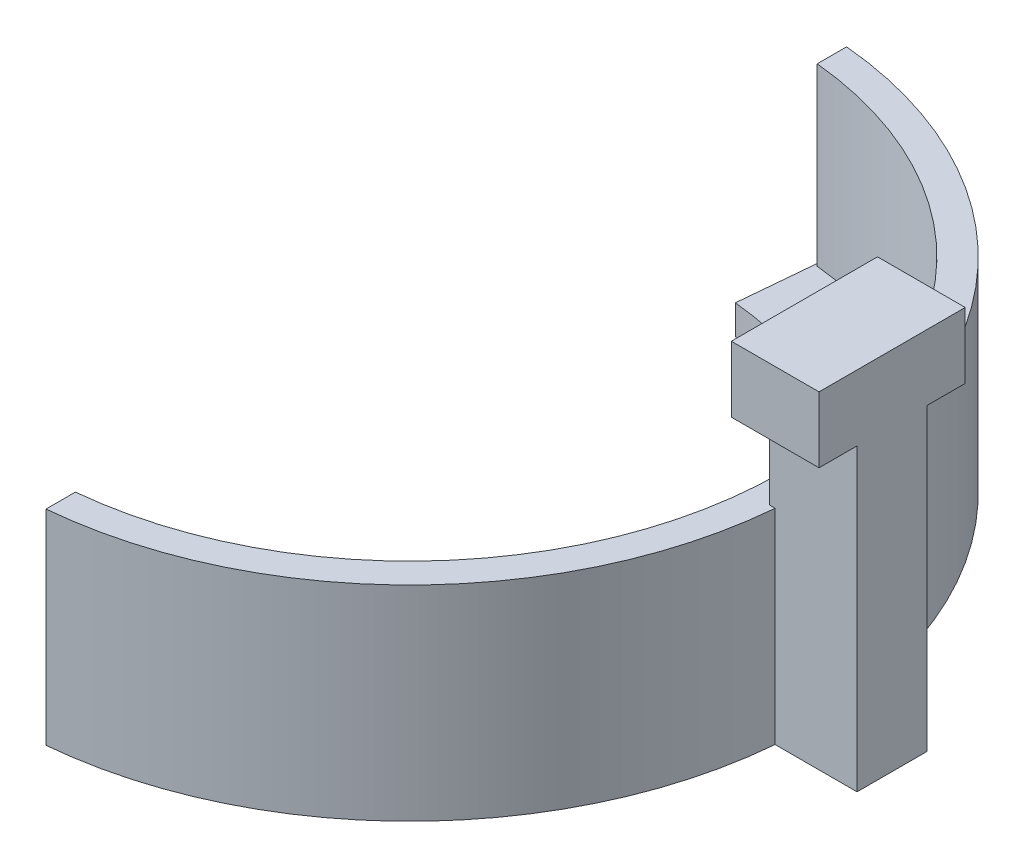
ISO-10303-21;
HEADER;
FILE_DESCRIPTION(('STEP AP214'),'2;1');
FILE_NAME('part.step','',(''),(''),'','','');
FILE_SCHEMA(('AUTOMOTIVE_DESIGN { 1 0 10303 214 1 1 1 1 }'));
ENDSEC;
DATA;
#1=APPLICATION_CONTEXT('core data for automotive mechanical design processes');
#2=APPLICATION_PROTOCOL_DEFINITION('international standard','automotive_design',2000,#1);
#3=PRODUCT_CONTEXT('',#1,'mechanical');
#4=PRODUCT('Part','Part','',(#3));
#5=PRODUCT_RELATED_PRODUCT_CATEGORY('part','',(#4));
#6=PRODUCT_DEFINITION_FORMATION('','',#4);
#7=PRODUCT_DEFINITION_CONTEXT('part definition',#1,'design');
#8=PRODUCT_DEFINITION('design','',#6,#7);
#9=PRODUCT_DEFINITION_SHAPE('','',#8);
#10=(LENGTH_UNIT() NAMED_UNIT(*) SI_UNIT(.MILLI.,.METRE.));
#11=(NAMED_UNIT(*) PLANE_ANGLE_UNIT() SI_UNIT($,.RADIAN.));
#12=(NAMED_UNIT(*) SI_UNIT($,.STERADIAN.) SOLID_ANGLE_UNIT());
#13=UNCERTAINTY_MEASURE_WITH_UNIT(LENGTH_MEASURE(1.E-05),#10,'distance_accuracy_value','');
#14=(GEOMETRIC_REPRESENTATION_CONTEXT(3) GLOBAL_UNCERTAINTY_ASSIGNED_CONTEXT((#13)) GLOBAL_UNIT_ASSIGNED_CONTEXT((#10,
#11,#12)) REPRESENTATION_CONTEXT('',''));
#15=CARTESIAN_POINT('',(0.,0.,0.));
#16=DIRECTION('',(0.,0.,1.));
#17=DIRECTION('',(1.,0.,0.));
#18=AXIS2_PLACEMENT_3D('',#15,#16,#17);
#19=CARTESIAN_POINT('',(27.,20.,-2.4));
#20=DIRECTION('',(0.,0.,1.));
#21=DIRECTION('',(1.,0.,0.));
#22=AXIS2_PLACEMENT_3D('',#19,#20,#21);
#23=PLANE('',#22);
#24=DIRECTION('',(-1.,0.,0.));
#25=VECTOR('',#24,1.);
#26=CARTESIAN_POINT('',(27.,18.5,-2.4));
#27=LINE('',#26,#25);
#28=CARTESIAN_POINT('',(33.,18.5,-2.4));
#29=VERTEX_POINT('',#28);
#30=CARTESIAN_POINT('',(27.,18.5,-2.4));
#31=VERTEX_POINT('',#30);
#32=EDGE_CURVE('E63',#29,#31,#27,.T.);
#33=ORIENTED_EDGE('',*,*,#32,.F.);
#34=DIRECTION('',(0.,-1.,0.));
#35=VECTOR('',#34,1.);
#36=CARTESIAN_POINT('',(33.,20.,-2.4));
#37=LINE('',#36,#35);
#38=CARTESIAN_POINT('',(33.,-2.,-2.4));
#39=VERTEX_POINT('',#38);
#40=EDGE_CURVE('E239',#29,#39,#37,.T.);
#41=ORIENTED_EDGE('',*,*,#40,.T.);
#42=DIRECTION('',(-1.,0.,0.));
#43=VECTOR('',#42,1.);
#44=CARTESIAN_POINT('',(27.,-2.,-2.4));
#45=LINE('',#44,#43);
#46=CARTESIAN_POINT('',(27.3950725496393,-2.,-2.4));
#47=VERTEX_POINT('',#46);
#48=EDGE_CURVE('E225',#39,#47,#45,.T.);
#49=ORIENTED_EDGE('',*,*,#48,.T.);
#50=DIRECTION('',(0.,-1.,0.));
#51=VECTOR('',#50,1.);
#52=CARTESIAN_POINT('',(27.3950725496393,12.,-2.4));
#53=LINE('',#52,#51);
#54=CARTESIAN_POINT('',(27.3950725496393,12.,-2.4));
#55=VERTEX_POINT('',#54);
#56=EDGE_CURVE('E257',#47,#55,#53,.F.);
#57=ORIENTED_EDGE('',*,*,#56,.T.);
#58=DIRECTION('',(1.,0.,0.));
#59=VECTOR('',#58,1.);
#60=CARTESIAN_POINT('',(0.,12.,-2.4));
#61=LINE('',#60,#59);
#62=CARTESIAN_POINT('',(27.,12.,-2.4));
#63=VERTEX_POINT('',#62);
#64=EDGE_CURVE('E253',#63,#55,#61,.T.);
#65=ORIENTED_EDGE('',*,*,#64,.F.);
#66=DIRECTION('',(0.,-1.,0.));
#67=VECTOR('',#66,1.);
#68=CARTESIAN_POINT('',(27.,20.,-2.4));
#69=LINE('',#68,#67);
#70=EDGE_CURVE('E236',#31,#63,#69,.T.);
#71=ORIENTED_EDGE('',*,*,#70,.F.);
#72=EDGE_LOOP('',(#33,#41,#49,#57,#65,#71));
#73=FACE_BOUND('',#72,.T.);
#74=ADVANCED_FACE('F39',(#73),#23,.F.);
#75=CARTESIAN_POINT('',(27.,20.,2.4));
#76=DIRECTION('',(0.,0.,-1.));
#77=DIRECTION('',(-1.,0.,0.));
#78=AXIS2_PLACEMENT_3D('',#75,#76,#77);
#79=PLANE('',#78);
#80=DIRECTION('',(1.,0.,0.));
#81=VECTOR('',#80,1.);
#82=CARTESIAN_POINT('',(27.,18.5,2.4));
#83=LINE('',#82,#81);
#84=CARTESIAN_POINT('',(27.,18.5,2.4));
#85=VERTEX_POINT('',#84);
#86=CARTESIAN_POINT('',(33.,18.5,2.4));
#87=VERTEX_POINT('',#86);
#88=EDGE_CURVE('E211',#85,#87,#83,.T.);
#89=ORIENTED_EDGE('',*,*,#88,.F.);
#90=DIRECTION('',(0.,-1.,0.));
#91=VECTOR('',#90,1.);
#92=CARTESIAN_POINT('',(27.,20.,2.4));
#93=LINE('',#92,#91);
#94=CARTESIAN_POINT('',(27.,12.,2.4));
#95=VERTEX_POINT('',#94);
#96=EDGE_CURVE('E233',#85,#95,#93,.T.);
#97=ORIENTED_EDGE('',*,*,#96,.T.);
#98=DIRECTION('',(-1.,0.,0.));
#99=VECTOR('',#98,1.);
#100=CARTESIAN_POINT('',(0.,12.,2.4));
#101=LINE('',#100,#99);
#102=CARTESIAN_POINT('',(27.3950725496393,12.,2.4));
#103=VERTEX_POINT('',#102);
#104=EDGE_CURVE('E242',#103,#95,#101,.T.);
#105=ORIENTED_EDGE('',*,*,#104,.F.);
#106=DIRECTION('',(0.,-1.,0.));
#107=VECTOR('',#106,1.);
#108=CARTESIAN_POINT('',(27.3950725496393,12.,2.4));
#109=LINE('',#108,#107);
#110=CARTESIAN_POINT('',(27.3950725496393,-2.,2.4));
#111=VERTEX_POINT('',#110);
#112=EDGE_CURVE('E246',#103,#111,#109,.T.);
#113=ORIENTED_EDGE('',*,*,#112,.T.);
#114=DIRECTION('',(1.,0.,0.));
#115=VECTOR('',#114,1.);
#116=CARTESIAN_POINT('',(27.,-2.,2.4));
#117=LINE('',#116,#115);
#118=CARTESIAN_POINT('',(33.,-2.,2.4));
#119=VERTEX_POINT('',#118);
#120=EDGE_CURVE('E228',#111,#119,#117,.T.);
#121=ORIENTED_EDGE('',*,*,#120,.T.);
#122=DIRECTION('',(0.,-1.,0.));
#123=VECTOR('',#122,1.);
#124=CARTESIAN_POINT('',(33.,20.,2.4));
#125=LINE('',#124,#123);
#126=EDGE_CURVE('E55',#87,#119,#125,.T.);
#127=ORIENTED_EDGE('',*,*,#126,.F.);
#128=EDGE_LOOP('',(#89,#97,#105,#113,#121,#127));
#129=FACE_BOUND('',#128,.T.);
#130=ADVANCED_FACE('F376',(#129),#79,.F.);
#131=CARTESIAN_POINT('',(0.,12.,0.));
#132=DIRECTION('',(0.,-1.,0.));
#133=DIRECTION('',(0.,0.,-1.));
#134=AXIS2_PLACEMENT_3D('',#131,#132,#133);
#135=CYLINDRICAL_SURFACE('',#134,27.5);
#136=ORIENTED_EDGE('',*,*,#56,.F.);
#137=CARTESIAN_POINT('',(0.,-2.,0.));
#138=DIRECTION('',(0.,1.,0.));
#139=DIRECTION('',(0.,0.,-1.));
#140=AXIS2_PLACEMENT_3D('',#137,#138,#139);
#141=CIRCLE('',#140,27.5);
#142=CARTESIAN_POINT('',(2.5,-2.,-27.3861278752583));
#143=VERTEX_POINT('',#142);
#144=EDGE_CURVE('E266',#47,#143,#141,.T.);
#145=ORIENTED_EDGE('',*,*,#144,.T.);
#146=DIRECTION('',(0.,1.,0.));
#147=VECTOR('',#146,1.);
#148=CARTESIAN_POINT('',(2.5,-2.,-27.3861278752583));
#149=LINE('',#148,#147);
#150=CARTESIAN_POINT('',(2.5,0.,-27.3861278752583));
#151=VERTEX_POINT('',#150);
#152=EDGE_CURVE('E278',#143,#151,#149,.T.);
#153=ORIENTED_EDGE('',*,*,#152,.T.);
#154=DIRECTION('',(0.,-1.,0.));
#155=VECTOR('',#154,1.);
#156=CARTESIAN_POINT('',(2.5,12.,-27.3861278752583));
#157=LINE('',#156,#155);
#158=CARTESIAN_POINT('',(2.5,12.,-27.3861278752583));
#159=VERTEX_POINT('',#158);
#160=EDGE_CURVE('E11',#159,#151,#157,.T.);
#161=ORIENTED_EDGE('',*,*,#160,.F.);
#162=CARTESIAN_POINT('',(0.,12.,0.));
#163=DIRECTION('',(0.,1.,0.));
#164=DIRECTION('',(0.,0.,1.));
#165=AXIS2_PLACEMENT_3D('',#162,#163,#164);
#166=CIRCLE('',#165,27.5);
#167=EDGE_CURVE('E308',#55,#159,#166,.T.);
#168=ORIENTED_EDGE('',*,*,#167,.F.);
#169=EDGE_LOOP('',(#136,#145,#153,#161,#168));
#170=FACE_BOUND('',#169,.T.);
#171=ADVANCED_FACE('F41',(#170),#135,.T.);
#172=ORIENTED_EDGE('',*,*,#112,.F.);
#173=CARTESIAN_POINT('',(2.5,12.,27.3861278752583));
#174=VERTEX_POINT('',#173);
#175=EDGE_CURVE('E303',#174,#103,#166,.T.);
#176=ORIENTED_EDGE('',*,*,#175,.F.);
#177=DIRECTION('',(0.,-1.,0.));
#178=VECTOR('',#177,1.);
#179=CARTESIAN_POINT('',(2.5,12.,27.3861278752583));
#180=LINE('',#179,#178);
#181=CARTESIAN_POINT('',(2.5,0.,27.3861278752583));
#182=VERTEX_POINT('',#181);
#183=EDGE_CURVE('E317',#174,#182,#180,.T.);
#184=ORIENTED_EDGE('',*,*,#183,.T.);
#185=DIRECTION('',(0.,1.,0.));
#186=VECTOR('',#185,1.);
#187=CARTESIAN_POINT('',(2.5,-2.,27.3861278752583));
#188=LINE('',#187,#186);
#189=CARTESIAN_POINT('',(2.5,-2.,27.3861278752583));
#190=VERTEX_POINT('',#189);
#191=EDGE_CURVE('E290',#190,#182,#188,.T.);
#192=ORIENTED_EDGE('',*,*,#191,.F.);
#193=EDGE_CURVE('E261',#190,#111,#141,.T.);
#194=ORIENTED_EDGE('',*,*,#193,.T.);
#195=EDGE_LOOP('',(#172,#176,#184,#192,#194));
#196=FACE_BOUND('',#195,.T.);
#197=ADVANCED_FACE('F368',(#196),#135,.T.);
#198=CARTESIAN_POINT('',(0.,12.,0.));
#199=DIRECTION('',(0.,1.,0.));
#200=DIRECTION('',(0.,0.,1.));
#201=AXIS2_PLACEMENT_3D('',#198,#199,#200);
#202=PLANE('',#201);
#203=DIRECTION('',(0.,0.,-1.));
#204=VECTOR('',#203,1.);
#205=CARTESIAN_POINT('',(27.,12.,0.));
#206=LINE('',#205,#204);
#207=EDGE_CURVE('E249',#95,#63,#206,.T.);
#208=ORIENTED_EDGE('',*,*,#207,.T.);
#209=ORIENTED_EDGE('',*,*,#64,.T.);
#210=ORIENTED_EDGE('',*,*,#167,.T.);
#211=DIRECTION('',(0.,0.,1.));
#212=VECTOR('',#211,1.);
#213=CARTESIAN_POINT('',(2.5,12.,-27.3861278752583));
#214=LINE('',#213,#212);
#215=CARTESIAN_POINT('',(2.5,12.,-25.377155080899));
#216=VERTEX_POINT('',#215);
#217=EDGE_CURVE('E307',#159,#216,#214,.T.);
#218=ORIENTED_EDGE('',*,*,#217,.T.);
#219=CARTESIAN_POINT('',(0.,12.,0.));
#220=DIRECTION('',(0.,-1.,0.));
#221=DIRECTION('',(0.,0.,1.));
#222=AXIS2_PLACEMENT_3D('',#219,#220,#221);
#223=CIRCLE('',#222,25.5);
#224=CARTESIAN_POINT('',(2.5,12.,25.377155080899));
#225=VERTEX_POINT('',#224);
#226=EDGE_CURVE('E311',#216,#225,#223,.T.);
#227=ORIENTED_EDGE('',*,*,#226,.T.);
#228=DIRECTION('',(0.,0.,1.));
#229=VECTOR('',#228,1.);
#230=CARTESIAN_POINT('',(2.5,12.,25.377155080899));
#231=LINE('',#230,#229);
#232=EDGE_CURVE('E314',#225,#174,#231,.T.);
#233=ORIENTED_EDGE('',*,*,#232,.T.);
#234=ORIENTED_EDGE('',*,*,#175,.T.);
#235=ORIENTED_EDGE('',*,*,#104,.T.);
#236=EDGE_LOOP('',(#208,#209,#210,#218,#227,#233,#234,#235));
#237=FACE_BOUND('',#236,.T.);
#238=ADVANCED_FACE('F378',(#237),#202,.T.);
#239=CARTESIAN_POINT('',(2.5,12.,-27.3861278752583));
#240=DIRECTION('',(1.,0.,0.));
#241=DIRECTION('',(0.,0.,-1.));
#242=AXIS2_PLACEMENT_3D('',#239,#240,#241);
#243=PLANE('',#242);
#244=DIRECTION('',(0.,0.,1.));
#245=VECTOR('',#244,1.);
#246=CARTESIAN_POINT('',(2.5,0.,-27.3861278752583));
#247=LINE('',#246,#245);
#248=CARTESIAN_POINT('',(2.5,0.,-25.377155080899));
#249=VERTEX_POINT('',#248);
#250=EDGE_CURVE('E293',#151,#249,#247,.T.);
#251=ORIENTED_EDGE('',*,*,#250,.T.);
#252=DIRECTION('',(0.,-1.,0.));
#253=VECTOR('',#252,1.);
#254=CARTESIAN_POINT('',(2.5,12.,-25.377155080899));
#255=LINE('',#254,#253);
#256=EDGE_CURVE('E48',#216,#249,#255,.T.);
#257=ORIENTED_EDGE('',*,*,#256,.F.);
#258=ORIENTED_EDGE('',*,*,#217,.F.);
#259=ORIENTED_EDGE('',*,*,#160,.T.);
#260=EDGE_LOOP('',(#251,#257,#258,#259));
#261=FACE_BOUND('',#260,.T.);
#262=ADVANCED_FACE('F344',(#261),#243,.F.);
#263=CARTESIAN_POINT('',(0.,12.,0.));
#264=DIRECTION('',(0.,-1.,0.));
#265=DIRECTION('',(0.,0.,-1.));
#266=AXIS2_PLACEMENT_3D('',#263,#264,#265);
#267=CYLINDRICAL_SURFACE('',#266,25.5);
#268=CARTESIAN_POINT('',(0.,0.,0.));
#269=DIRECTION('',(0.,-1.,0.));
#270=DIRECTION('',(0.,0.,1.));
#271=AXIS2_PLACEMENT_3D('',#268,#269,#270);
#272=CIRCLE('',#271,25.5);
#273=CARTESIAN_POINT('',(2.5,0.,25.377155080899));
#274=VERTEX_POINT('',#273);
#275=EDGE_CURVE('E321',#249,#274,#272,.T.);
#276=ORIENTED_EDGE('',*,*,#275,.T.);
#277=DIRECTION('',(0.,-1.,0.));
#278=VECTOR('',#277,1.);
#279=CARTESIAN_POINT('',(2.5,12.,25.377155080899));
#280=LINE('',#279,#278);
#281=EDGE_CURVE('E332',#225,#274,#280,.T.);
#282=ORIENTED_EDGE('',*,*,#281,.F.);
#283=ORIENTED_EDGE('',*,*,#226,.F.);
#284=ORIENTED_EDGE('',*,*,#256,.T.);
#285=EDGE_LOOP('',(#276,#282,#283,#284));
#286=FACE_BOUND('',#285,.T.);
#287=ADVANCED_FACE('F340',(#286),#267,.F.);
#288=CARTESIAN_POINT('',(2.5,12.,25.377155080899));
#289=DIRECTION('',(1.,0.,0.));
#290=DIRECTION('',(0.,0.,-1.));
#291=AXIS2_PLACEMENT_3D('',#288,#289,#290);
#292=PLANE('',#291);
#293=DIRECTION('',(0.,0.,1.));
#294=VECTOR('',#293,1.);
#295=CARTESIAN_POINT('',(2.5,0.,25.377155080899));
#296=LINE('',#295,#294);
#297=EDGE_CURVE('E325',#274,#182,#296,.T.);
#298=ORIENTED_EDGE('',*,*,#297,.T.);
#299=ORIENTED_EDGE('',*,*,#183,.F.);
#300=ORIENTED_EDGE('',*,*,#232,.F.);
#301=ORIENTED_EDGE('',*,*,#281,.T.);
#302=EDGE_LOOP('',(#298,#299,#300,#301));
#303=FACE_BOUND('',#302,.T.);
#304=ADVANCED_FACE('F381',(#303),#292,.F.);
#305=CARTESIAN_POINT('',(2.5,-2.,27.3861278752583));
#306=DIRECTION('',(-0.995859195463938,0.,0.0909090909090934));
#307=DIRECTION('',(0.0909090909090934,0.,0.995859195463938));
#308=AXIS2_PLACEMENT_3D('',#305,#306,#307);
#309=PLANE('',#308);
#310=DIRECTION('',(0.0909090909090934,0.,0.995859195463938));
#311=VECTOR('',#310,1.);
#312=CARTESIAN_POINT('',(2.5,0.,27.3861278752583));
#313=LINE('',#312,#311);
#314=CARTESIAN_POINT('',(1.86363636363634,0.,20.4151135070107));
#315=VERTEX_POINT('',#314);
#316=EDGE_CURVE('E286',#315,#182,#313,.T.);
#317=ORIENTED_EDGE('',*,*,#316,.F.);
#318=DIRECTION('',(0.,1.,0.));
#319=VECTOR('',#318,1.);
#320=CARTESIAN_POINT('',(1.86363636363634,-2.,20.4151135070107));
#321=LINE('',#320,#319);
#322=CARTESIAN_POINT('',(1.86363636363634,-2.,20.4151135070107));
#323=VERTEX_POINT('',#322);
#324=EDGE_CURVE('E294',#323,#315,#321,.T.);
#325=ORIENTED_EDGE('',*,*,#324,.F.);
#326=DIRECTION('',(0.0909090909090934,0.,0.995859195463938));
#327=VECTOR('',#326,1.);
#328=CARTESIAN_POINT('',(2.5,-2.,27.3861278752583));
#329=LINE('',#328,#327);
#330=EDGE_CURVE('E274',#323,#190,#329,.T.);
#331=ORIENTED_EDGE('',*,*,#330,.T.);
#332=ORIENTED_EDGE('',*,*,#191,.T.);
#333=EDGE_LOOP('',(#317,#325,#331,#332));
#334=FACE_BOUND('',#333,.T.);
#335=ADVANCED_FACE('F363',(#334),#309,.T.);
#336=CARTESIAN_POINT('',(0.,-2.,0.));
#337=DIRECTION('',(0.,1.,0.));
#338=DIRECTION('',(0.,0.,1.));
#339=AXIS2_PLACEMENT_3D('',#336,#337,#338);
#340=CYLINDRICAL_SURFACE('',#339,20.5);
#341=CARTESIAN_POINT('',(0.,0.,0.));
#342=DIRECTION('',(0.,-1.,0.));
#343=DIRECTION('',(0.,0.,-1.));
#344=AXIS2_PLACEMENT_3D('',#341,#342,#343);
#345=CIRCLE('',#344,20.5);
#346=CARTESIAN_POINT('',(1.86363636363636,0.,-20.4151135070107));
#347=VERTEX_POINT('',#346);
#348=EDGE_CURVE('E282',#347,#315,#345,.T.);
#349=ORIENTED_EDGE('',*,*,#348,.F.);
#350=DIRECTION('',(0.,1.,0.));
#351=VECTOR('',#350,1.);
#352=CARTESIAN_POINT('',(1.86363636363636,-2.,-20.4151135070107));
#353=LINE('',#352,#351);
#354=CARTESIAN_POINT('',(1.86363636363636,-2.,-20.4151135070107));
#355=VERTEX_POINT('',#354);
#356=EDGE_CURVE('E297',#355,#347,#353,.T.);
#357=ORIENTED_EDGE('',*,*,#356,.F.);
#358=CARTESIAN_POINT('',(0.,-2.,0.));
#359=DIRECTION('',(0.,-1.,0.));
#360=DIRECTION('',(0.,0.,-1.));
#361=AXIS2_PLACEMENT_3D('',#358,#359,#360);
#362=CIRCLE('',#361,20.5);
#363=EDGE_CURVE('E270',#355,#323,#362,.T.);
#364=ORIENTED_EDGE('',*,*,#363,.T.);
#365=ORIENTED_EDGE('',*,*,#324,.T.);
#366=EDGE_LOOP('',(#349,#357,#364,#365));
#367=FACE_BOUND('',#366,.T.);
#368=ADVANCED_FACE('F360',(#367),#340,.F.);
#369=CARTESIAN_POINT('',(2.5,-2.,-27.3861278752583));
#370=DIRECTION('',(-0.995859195463938,0.,-0.0909090909090919));
#371=DIRECTION('',(-0.0909090909090919,0.,0.995859195463938));
#372=AXIS2_PLACEMENT_3D('',#369,#370,#371);
#373=PLANE('',#372);
#374=DIRECTION('',(-0.0909090909090919,0.,0.995859195463938));
#375=VECTOR('',#374,1.);
#376=CARTESIAN_POINT('',(2.5,0.,-27.3861278752583));
#377=LINE('',#376,#375);
#378=EDGE_CURVE('E260',#151,#347,#377,.T.);
#379=ORIENTED_EDGE('',*,*,#378,.F.);
#380=ORIENTED_EDGE('',*,*,#152,.F.);
#381=DIRECTION('',(-0.0909090909090919,0.,0.995859195463938));
#382=VECTOR('',#381,1.);
#383=CARTESIAN_POINT('',(2.5,-2.,-27.3861278752583));
#384=LINE('',#383,#382);
#385=EDGE_CURVE('E265',#143,#355,#384,.T.);
#386=ORIENTED_EDGE('',*,*,#385,.T.);
#387=ORIENTED_EDGE('',*,*,#356,.T.);
#388=EDGE_LOOP('',(#379,#380,#386,#387));
#389=FACE_BOUND('',#388,.T.);
#390=ADVANCED_FACE('F356',(#389),#373,.T.);
#391=CARTESIAN_POINT('',(0.,-2.,0.));
#392=DIRECTION('',(0.,-1.,0.));
#393=DIRECTION('',(0.,0.,-1.));
#394=AXIS2_PLACEMENT_3D('',#391,#392,#393);
#395=PLANE('',#394);
#396=ORIENTED_EDGE('',*,*,#144,.F.);
#397=ORIENTED_EDGE('',*,*,#48,.F.);
#398=DIRECTION('',(0.,0.,-1.));
#399=VECTOR('',#398,1.);
#400=CARTESIAN_POINT('',(33.,-2.,-2.4));
#401=LINE('',#400,#399);
#402=EDGE_CURVE('E221',#119,#39,#401,.T.);
#403=ORIENTED_EDGE('',*,*,#402,.F.);
#404=ORIENTED_EDGE('',*,*,#120,.F.);
#405=ORIENTED_EDGE('',*,*,#193,.F.);
#406=ORIENTED_EDGE('',*,*,#330,.F.);
#407=ORIENTED_EDGE('',*,*,#363,.F.);
#408=ORIENTED_EDGE('',*,*,#385,.F.);
#409=EDGE_LOOP('',(#396,#397,#403,#404,#405,#406,#407,#408));
#410=FACE_BOUND('',#409,.T.);
#411=ADVANCED_FACE('F373',(#410),#395,.T.);
#412=CARTESIAN_POINT('',(0.,0.,0.));
#413=DIRECTION('',(0.,-1.,0.));
#414=DIRECTION('',(0.,0.,-1.));
#415=AXIS2_PLACEMENT_3D('',#412,#413,#414);
#416=PLANE('',#415);
#417=ORIENTED_EDGE('',*,*,#297,.F.);
#418=ORIENTED_EDGE('',*,*,#275,.F.);
#419=ORIENTED_EDGE('',*,*,#250,.F.);
#420=ORIENTED_EDGE('',*,*,#378,.T.);
#421=ORIENTED_EDGE('',*,*,#348,.T.);
#422=ORIENTED_EDGE('',*,*,#316,.T.);
#423=EDGE_LOOP('',(#417,#418,#419,#420,#421,#422));
#424=FACE_BOUND('',#423,.T.);
#425=ADVANCED_FACE('F347',(#424),#416,.F.);
#426=CARTESIAN_POINT('',(33.,20.,-2.4));
#427=DIRECTION('',(-1.,0.,0.));
#428=DIRECTION('',(0.,0.,1.));
#429=AXIS2_PLACEMENT_3D('',#426,#427,#428);
#430=PLANE('',#429);
#431=ORIENTED_EDGE('',*,*,#40,.F.);
#432=DIRECTION('',(0.,0.,-1.));
#433=VECTOR('',#432,1.);
#434=CARTESIAN_POINT('',(33.,18.5,-5.));
#435=LINE('',#434,#433);
#436=CARTESIAN_POINT('',(33.,18.5,-5.));
#437=VERTEX_POINT('',#436);
#438=EDGE_CURVE('E165',#29,#437,#435,.T.);
#439=ORIENTED_EDGE('',*,*,#438,.T.);
#440=DIRECTION('',(0.,1.,0.));
#441=VECTOR('',#440,1.);
#442=CARTESIAN_POINT('',(33.,18.5,-5.));
#443=LINE('',#442,#441);
#444=CARTESIAN_POINT('',(33.,23.,-5.));
#445=VERTEX_POINT('',#444);
#446=EDGE_CURVE('E159',#437,#445,#443,.T.);
#447=ORIENTED_EDGE('',*,*,#446,.T.);
#448=DIRECTION('',(0.,0.,-1.));
#449=VECTOR('',#448,1.);
#450=CARTESIAN_POINT('',(33.,23.,-5.));
#451=LINE('',#450,#449);
#452=CARTESIAN_POINT('',(33.,23.,5.));
#453=VERTEX_POINT('',#452);
#454=EDGE_CURVE('E163',#453,#445,#451,.T.);
#455=ORIENTED_EDGE('',*,*,#454,.F.);
#456=DIRECTION('',(0.,1.,0.));
#457=VECTOR('',#456,1.);
#458=CARTESIAN_POINT('',(33.,18.5,5.));
#459=LINE('',#458,#457);
#460=CARTESIAN_POINT('',(33.,18.5,5.));
#461=VERTEX_POINT('',#460);
#462=EDGE_CURVE('E208',#461,#453,#459,.T.);
#463=ORIENTED_EDGE('',*,*,#462,.F.);
#464=EDGE_CURVE('E193',#461,#87,#435,.T.);
#465=ORIENTED_EDGE('',*,*,#464,.T.);
#466=ORIENTED_EDGE('',*,*,#126,.T.);
#467=ORIENTED_EDGE('',*,*,#402,.T.);
#468=EDGE_LOOP('',(#431,#439,#447,#455,#463,#465,#466,#467));
#469=FACE_BOUND('',#468,.T.);
#470=ADVANCED_FACE('F161',(#469),#430,.F.);
#471=CARTESIAN_POINT('',(27.,20.,-2.4));
#472=DIRECTION('',(1.,0.,0.));
#473=DIRECTION('',(0.,0.,-1.));
#474=AXIS2_PLACEMENT_3D('',#471,#472,#473);
#475=PLANE('',#474);
#476=DIRECTION('',(0.,0.,1.));
#477=VECTOR('',#476,1.);
#478=CARTESIAN_POINT('',(27.,18.5,-5.));
#479=LINE('',#478,#477);
#480=CARTESIAN_POINT('',(27.,18.5,-5.));
#481=VERTEX_POINT('',#480);
#482=EDGE_CURVE('E201',#481,#31,#479,.T.);
#483=ORIENTED_EDGE('',*,*,#482,.T.);
#484=ORIENTED_EDGE('',*,*,#70,.T.);
#485=ORIENTED_EDGE('',*,*,#207,.F.);
#486=ORIENTED_EDGE('',*,*,#96,.F.);
#487=CARTESIAN_POINT('',(27.,18.5,5.));
#488=VERTEX_POINT('',#487);
#489=EDGE_CURVE('E200',#85,#488,#479,.T.);
#490=ORIENTED_EDGE('',*,*,#489,.T.);
#491=DIRECTION('',(0.,1.,0.));
#492=VECTOR('',#491,1.);
#493=CARTESIAN_POINT('',(27.,18.5,5.));
#494=LINE('',#493,#492);
#495=CARTESIAN_POINT('',(27.,23.,5.));
#496=VERTEX_POINT('',#495);
#497=EDGE_CURVE('E212',#488,#496,#494,.T.);
#498=ORIENTED_EDGE('',*,*,#497,.T.);
#499=DIRECTION('',(0.,0.,1.));
#500=VECTOR('',#499,1.);
#501=CARTESIAN_POINT('',(27.,23.,-5.));
#502=LINE('',#501,#500);
#503=CARTESIAN_POINT('',(27.,23.,-5.));
#504=VERTEX_POINT('',#503);
#505=EDGE_CURVE('E180',#504,#496,#502,.T.);
#506=ORIENTED_EDGE('',*,*,#505,.F.);
#507=DIRECTION('',(0.,1.,0.));
#508=VECTOR('',#507,1.);
#509=CARTESIAN_POINT('',(27.,18.5,-5.));
#510=LINE('',#509,#508);
#511=EDGE_CURVE('E170',#481,#504,#510,.T.);
#512=ORIENTED_EDGE('',*,*,#511,.F.);
#513=EDGE_LOOP('',(#483,#484,#485,#486,#490,#498,#506,#512));
#514=FACE_BOUND('',#513,.T.);
#515=ADVANCED_FACE('F399',(#514),#475,.F.);
#516=CARTESIAN_POINT('',(0.,18.5,0.));
#517=DIRECTION('',(0.,1.,0.));
#518=DIRECTION('',(0.,0.,1.));
#519=AXIS2_PLACEMENT_3D('',#516,#517,#518);
#520=PLANE('',#519);
#521=ORIENTED_EDGE('',*,*,#438,.F.);
#522=ORIENTED_EDGE('',*,*,#32,.T.);
#523=ORIENTED_EDGE('',*,*,#482,.F.);
#524=DIRECTION('',(-1.,0.,0.));
#525=VECTOR('',#524,1.);
#526=CARTESIAN_POINT('',(27.,18.5,-5.));
#527=LINE('',#526,#525);
#528=EDGE_CURVE('E197',#437,#481,#527,.T.);
#529=ORIENTED_EDGE('',*,*,#528,.F.);
#530=EDGE_LOOP('',(#521,#522,#523,#529));
#531=FACE_BOUND('',#530,.T.);
#532=ADVANCED_FACE('F444',(#531),#520,.F.);
#533=ORIENTED_EDGE('',*,*,#489,.F.);
#534=ORIENTED_EDGE('',*,*,#88,.T.);
#535=ORIENTED_EDGE('',*,*,#464,.F.);
#536=DIRECTION('',(1.,0.,0.));
#537=VECTOR('',#536,1.);
#538=CARTESIAN_POINT('',(27.,18.5,5.));
#539=LINE('',#538,#537);
#540=EDGE_CURVE('E171',#488,#461,#539,.T.);
#541=ORIENTED_EDGE('',*,*,#540,.F.);
#542=EDGE_LOOP('',(#533,#534,#535,#541));
#543=FACE_BOUND('',#542,.T.);
#544=ADVANCED_FACE('F453',(#543),#520,.F.);
#545=CARTESIAN_POINT('',(27.,18.5,5.));
#546=DIRECTION('',(0.,0.,1.));
#547=DIRECTION('',(1.,0.,0.));
#548=AXIS2_PLACEMENT_3D('',#545,#546,#547);
#549=PLANE('',#548);
#550=ORIENTED_EDGE('',*,*,#462,.T.);
#551=DIRECTION('',(1.,0.,0.));
#552=VECTOR('',#551,1.);
#553=CARTESIAN_POINT('',(27.,23.,5.));
#554=LINE('',#553,#552);
#555=EDGE_CURVE('E185',#496,#453,#554,.T.);
#556=ORIENTED_EDGE('',*,*,#555,.F.);
#557=ORIENTED_EDGE('',*,*,#497,.F.);
#558=ORIENTED_EDGE('',*,*,#540,.T.);
#559=EDGE_LOOP('',(#550,#556,#557,#558));
#560=FACE_BOUND('',#559,.T.);
#561=ADVANCED_FACE('F463',(#560),#549,.T.);
#562=CARTESIAN_POINT('',(27.,18.5,-5.));
#563=DIRECTION('',(0.,0.,-1.));
#564=DIRECTION('',(-1.,0.,0.));
#565=AXIS2_PLACEMENT_3D('',#562,#563,#564);
#566=PLANE('',#565);
#567=ORIENTED_EDGE('',*,*,#511,.T.);
#568=DIRECTION('',(-1.,0.,0.));
#569=VECTOR('',#568,1.);
#570=CARTESIAN_POINT('',(27.,23.,-5.));
#571=LINE('',#570,#569);
#572=EDGE_CURVE('E174',#445,#504,#571,.T.);
#573=ORIENTED_EDGE('',*,*,#572,.F.);
#574=ORIENTED_EDGE('',*,*,#446,.F.);
#575=ORIENTED_EDGE('',*,*,#528,.T.);
#576=EDGE_LOOP('',(#567,#573,#574,#575));
#577=FACE_BOUND('',#576,.T.);
#578=ADVANCED_FACE('F175',(#577),#566,.T.);
#579=CARTESIAN_POINT('',(0.,23.,0.));
#580=DIRECTION('',(0.,1.,0.));
#581=DIRECTION('',(0.,0.,1.));
#582=AXIS2_PLACEMENT_3D('',#579,#580,#581);
#583=PLANE('',#582);
#584=ORIENTED_EDGE('',*,*,#454,.T.);
#585=ORIENTED_EDGE('',*,*,#572,.T.);
#586=ORIENTED_EDGE('',*,*,#505,.T.);
#587=ORIENTED_EDGE('',*,*,#555,.T.);
#588=EDGE_LOOP('',(#584,#585,#586,#587));
#589=FACE_BOUND('',#588,.T.);
#590=ADVANCED_FACE('F183',(#589),#583,.T.);
#591=CLOSED_SHELL('',(#74,#130,#171,#197,#238,#262,#287,#304,#335,#368,#390,#411,#425,#470,#515,
#532,#544,#561,#578,#590));
#592=MANIFOLD_SOLID_BREP('B2',#591);
#593=ADVANCED_BREP_SHAPE_REPRESENTATION('',(#18,#592),#14);
#594=SHAPE_DEFINITION_REPRESENTATION(#9,#593);
ENDSEC;
END-ISO-10303-21;
